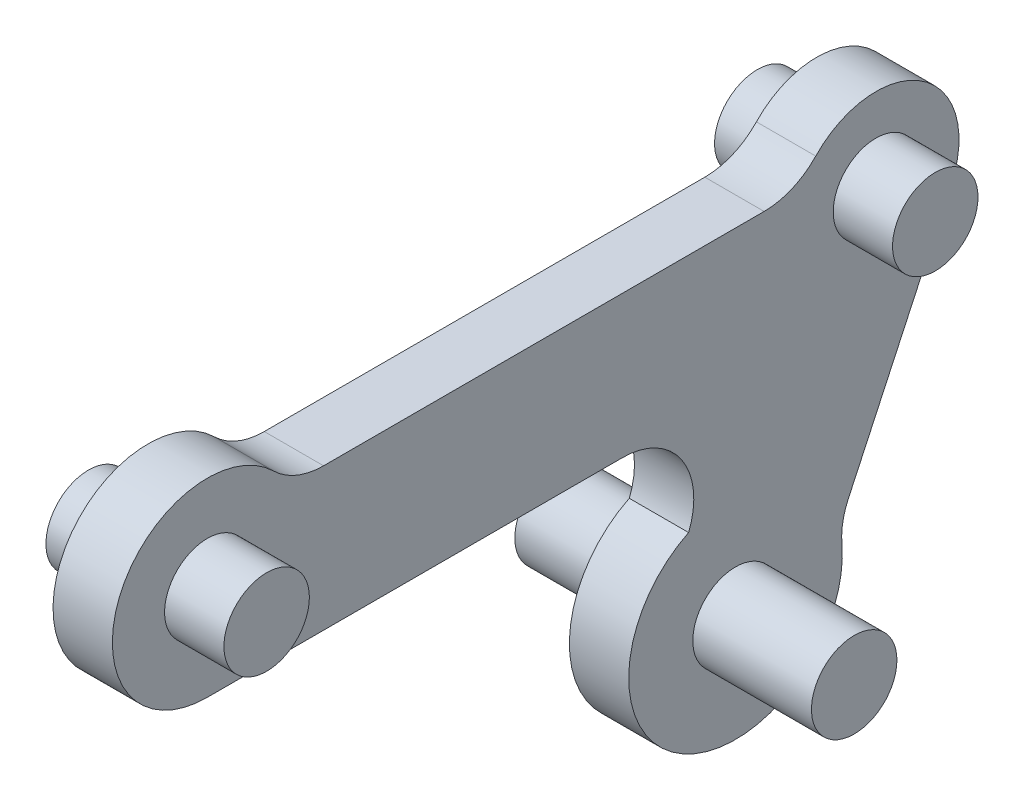
ISO-10303-21;
HEADER;
FILE_DESCRIPTION(('STEP AP214'),'2;1');
FILE_NAME('part.step','',(''),(''),'','','');
FILE_SCHEMA(('AUTOMOTIVE_DESIGN { 1 0 10303 214 1 1 1 1 }'));
ENDSEC;
DATA;
#1=APPLICATION_CONTEXT('core data for automotive mechanical design processes');
#2=APPLICATION_PROTOCOL_DEFINITION('international standard','automotive_design',2000,#1);
#3=PRODUCT_CONTEXT('',#1,'mechanical');
#4=PRODUCT('Part','Part','',(#3));
#5=PRODUCT_RELATED_PRODUCT_CATEGORY('part','',(#4));
#6=PRODUCT_DEFINITION_FORMATION('','',#4);
#7=PRODUCT_DEFINITION_CONTEXT('part definition',#1,'design');
#8=PRODUCT_DEFINITION('design','',#6,#7);
#9=PRODUCT_DEFINITION_SHAPE('','',#8);
#10=(LENGTH_UNIT() NAMED_UNIT(*) SI_UNIT(.MILLI.,.METRE.));
#11=(NAMED_UNIT(*) PLANE_ANGLE_UNIT() SI_UNIT($,.RADIAN.));
#12=(NAMED_UNIT(*) SI_UNIT($,.STERADIAN.) SOLID_ANGLE_UNIT());
#13=UNCERTAINTY_MEASURE_WITH_UNIT(LENGTH_MEASURE(1.E-05),#10,'distance_accuracy_value','');
#14=(GEOMETRIC_REPRESENTATION_CONTEXT(3) GLOBAL_UNCERTAINTY_ASSIGNED_CONTEXT((#13)) GLOBAL_UNIT_ASSIGNED_CONTEXT((#10,
#11,#12)) REPRESENTATION_CONTEXT('',''));
#15=CARTESIAN_POINT('',(0.,0.,0.));
#16=DIRECTION('',(0.,0.,1.));
#17=DIRECTION('',(1.,0.,0.));
#18=AXIS2_PLACEMENT_3D('',#15,#16,#17);
#19=CARTESIAN_POINT('',(1.25,-0.520836083907537,28.1720772546283));
#20=DIRECTION('',(1.,0.,0.));
#21=DIRECTION('',(0.,0.,-1.));
#22=AXIS2_PLACEMENT_3D('',#19,#20,#21);
#23=PLANE('',#22);
#24=CARTESIAN_POINT('',(1.25,-12.6883090185131,5.91665566436985));
#25=DIRECTION('',(1.,0.,0.));
#26=DIRECTION('',(0.,0.,-1.));
#27=AXIS2_PLACEMENT_3D('',#24,#25,#26);
#28=CIRCLE('',#27,1.8);
#29=CARTESIAN_POINT('',(1.25,-12.6883090185131,4.11665566436985));
#30=VERTEX_POINT('',#29);
#31=EDGE_CURVE('E264',#30,#30,#28,.T.);
#32=ORIENTED_EDGE('',*,*,#31,.F.);
#33=EDGE_LOOP('',(#32));
#34=FACE_BOUND('',#33,.T.);
#35=CARTESIAN_POINT('',(1.25,0.,0.));
#36=DIRECTION('',(1.,0.,0.));
#37=DIRECTION('',(0.,0.,-1.));
#38=AXIS2_PLACEMENT_3D('',#35,#36,#37);
#39=CIRCLE('',#38,1.8);
#40=CARTESIAN_POINT('',(1.25,0.,-1.8));
#41=VERTEX_POINT('',#40);
#42=EDGE_CURVE('E269',#41,#41,#39,.T.);
#43=ORIENTED_EDGE('',*,*,#42,.F.);
#44=EDGE_LOOP('',(#43));
#45=FACE_BOUND('',#44,.T.);
#46=CARTESIAN_POINT('',(1.25,-0.520836083907537,28.1720772546283));
#47=DIRECTION('',(1.,0.,0.));
#48=DIRECTION('',(0.,0.,-1.));
#49=AXIS2_PLACEMENT_3D('',#46,#47,#48);
#50=CIRCLE('',#49,1.8);
#51=CARTESIAN_POINT('',(1.25,-0.520836083907537,26.3720772546283));
#52=VERTEX_POINT('',#51);
#53=EDGE_CURVE('E277',#52,#52,#50,.T.);
#54=ORIENTED_EDGE('',*,*,#53,.F.);
#55=EDGE_LOOP('',(#54));
#56=FACE_BOUND('',#55,.T.);
#57=DIRECTION('',(0.,-0.906307787036648,0.422618261740703));
#58=VECTOR('',#57,1.);
#59=CARTESIAN_POINT('',(1.25,-1.47916391609246,-3.17207725462827));
#60=LINE('',#59,#58);
#61=CARTESIAN_POINT('',(1.25,-1.47916391609246,-3.17207725462827));
#62=VERTEX_POINT('',#61);
#63=CARTESIAN_POINT('',(1.25,-10.7763797085491,1.16328566891389));
#64=VERTEX_POINT('',#63);
#65=EDGE_CURVE('E304',#62,#64,#60,.T.);
#66=ORIENTED_EDGE('',*,*,#65,.F.);
#67=CARTESIAN_POINT('',(1.25,0.,0.));
#68=DIRECTION('',(1.,0.,0.));
#69=DIRECTION('',(0.,0.,-1.));
#70=AXIS2_PLACEMENT_3D('',#67,#68,#69);
#71=CIRCLE('',#70,3.5);
#72=CARTESIAN_POINT('',(1.25,2.41185749328056,2.53632478837124));
#73=VERTEX_POINT('',#72);
#74=EDGE_CURVE('E298',#62,#73,#71,.T.);
#75=ORIENTED_EDGE('',*,*,#74,.T.);
#76=CARTESIAN_POINT('',(1.25,4.47916391609246,4.71031746411802));
#77=DIRECTION('',(1.,0.,0.));
#78=DIRECTION('',(0.,0.,-1.));
#79=AXIS2_PLACEMENT_3D('',#76,#77,#78);
#80=CIRCLE('',#79,3.);
#81=CARTESIAN_POINT('',(1.25,1.47916391609246,4.71031746411802));
#82=VERTEX_POINT('',#81);
#83=EDGE_CURVE('E134',#73,#82,#80,.F.);
#84=ORIENTED_EDGE('',*,*,#83,.T.);
#85=DIRECTION('',(0.,0.,-1.));
#86=VECTOR('',#85,1.);
#87=CARTESIAN_POINT('',(1.25,1.47916391609246,28.1720772546283));
#88=LINE('',#87,#86);
#89=CARTESIAN_POINT('',(1.25,1.47916391609246,23.2730977690619));
#90=VERTEX_POINT('',#89);
#91=EDGE_CURVE('E290',#90,#82,#88,.T.);
#92=ORIENTED_EDGE('',*,*,#91,.F.);
#93=CARTESIAN_POINT('',(1.25,4.47916391609246,23.2730977690619));
#94=DIRECTION('',(1.,0.,0.));
#95=DIRECTION('',(0.,0.,-1.));
#96=AXIS2_PLACEMENT_3D('',#93,#94,#95);
#97=CIRCLE('',#96,3.);
#98=CARTESIAN_POINT('',(1.25,2.33630677323532,25.3726604057332));
#99=VERTEX_POINT('',#98);
#100=EDGE_CURVE('E12',#90,#99,#97,.F.);
#101=ORIENTED_EDGE('',*,*,#100,.T.);
#102=CARTESIAN_POINT('',(1.25,-0.520836083907537,28.1720772546283));
#103=DIRECTION('',(1.,0.,0.));
#104=DIRECTION('',(0.,0.,-1.));
#105=AXIS2_PLACEMENT_3D('',#102,#103,#104);
#106=CIRCLE('',#105,3.99999999999999);
#107=CARTESIAN_POINT('',(1.25,-4.52083608390754,28.1720772546283));
#108=VERTEX_POINT('',#107);
#109=EDGE_CURVE('E215',#99,#108,#106,.T.);
#110=ORIENTED_EDGE('',*,*,#109,.T.);
#111=DIRECTION('',(0.,0.,-1.));
#112=VECTOR('',#111,1.);
#113=CARTESIAN_POINT('',(1.25,-4.52083608390754,28.1720772546283));
#114=LINE('',#113,#112);
#115=CARTESIAN_POINT('',(1.25,-4.52083608390754,10.674509524397));
#116=VERTEX_POINT('',#115);
#117=EDGE_CURVE('E211',#108,#116,#114,.T.);
#118=ORIENTED_EDGE('',*,*,#117,.T.);
#119=CARTESIAN_POINT('',(1.25,-7.52083608390754,10.674509524397));
#120=DIRECTION('',(1.,0.,0.));
#121=DIRECTION('',(0.,0.,-1.));
#122=AXIS2_PLACEMENT_3D('',#119,#120,#121);
#123=CIRCLE('',#122,3.);
#124=CARTESIAN_POINT('',(1.25,-8.64571957419743,7.89338796407762));
#125=VERTEX_POINT('',#124);
#126=EDGE_CURVE('E334',#116,#125,#123,.F.);
#127=ORIENTED_EDGE('',*,*,#126,.T.);
#128=CARTESIAN_POINT('',(1.25,-12.6883090185131,5.91665566436985));
#129=DIRECTION('',(1.,0.,0.));
#130=DIRECTION('',(0.,0.,-1.));
#131=AXIS2_PLACEMENT_3D('',#128,#129,#130);
#132=CIRCLE('',#131,4.50000000000002);
#133=CARTESIAN_POINT('',(1.25,-12.3018643036679,1.4332796504303));
#134=VERTEX_POINT('',#133);
#135=EDGE_CURVE('E285',#125,#134,#132,.T.);
#136=ORIENTED_EDGE('',*,*,#135,.T.);
#137=CARTESIAN_POINT('',(1.25,-12.0442344937712,-1.55563769219605));
#138=DIRECTION('',(1.,0.,0.));
#139=DIRECTION('',(0.,0.,-1.));
#140=AXIS2_PLACEMENT_3D('',#137,#138,#139);
#141=CIRCLE('',#140,3.);
#142=EDGE_CURVE('E331',#134,#64,#141,.F.);
#143=ORIENTED_EDGE('',*,*,#142,.T.);
#144=EDGE_LOOP('',(#66,#75,#84,#92,#101,#110,#118,#127,#136,#143));
#145=FACE_BOUND('',#144,.T.);
#146=ADVANCED_FACE('F125',(#34,#45,#56,#145),#23,.T.);
#147=CARTESIAN_POINT('',(1.25,-0.520836083907537,28.1720772546283));
#148=DIRECTION('',(-1.,0.,0.));
#149=DIRECTION('',(0.,0.,1.));
#150=AXIS2_PLACEMENT_3D('',#147,#148,#149);
#151=CYLINDRICAL_SURFACE('',#150,3.99999999999999);
#152=ORIENTED_EDGE('',*,*,#109,.F.);
#153=DIRECTION('',(-1.,0.,0.));
#154=VECTOR('',#153,1.);
#155=CARTESIAN_POINT('',(1.25,2.33630677323532,25.3726604057332));
#156=LINE('',#155,#154);
#157=CARTESIAN_POINT('',(-1.25,2.33630677323532,25.3726604057332));
#158=VERTEX_POINT('',#157);
#159=EDGE_CURVE('E221',#99,#158,#156,.T.);
#160=ORIENTED_EDGE('',*,*,#159,.T.);
#161=CARTESIAN_POINT('',(-1.25,-0.520836083907537,28.1720772546283));
#162=DIRECTION('',(1.,0.,0.));
#163=DIRECTION('',(0.,0.,-1.));
#164=AXIS2_PLACEMENT_3D('',#161,#162,#163);
#165=CIRCLE('',#164,3.99999999999999);
#166=CARTESIAN_POINT('',(-1.25,-4.52083608390754,28.1720772546283));
#167=VERTEX_POINT('',#166);
#168=EDGE_CURVE('E218',#158,#167,#165,.T.);
#169=ORIENTED_EDGE('',*,*,#168,.T.);
#170=DIRECTION('',(-1.,0.,0.));
#171=VECTOR('',#170,1.);
#172=CARTESIAN_POINT('',(1.25,-4.52083608390753,28.1720772546283));
#173=LINE('',#172,#171);
#174=EDGE_CURVE('E204',#108,#167,#173,.T.);
#175=ORIENTED_EDGE('',*,*,#174,.F.);
#176=EDGE_LOOP('',(#152,#160,#169,#175));
#177=FACE_BOUND('',#176,.T.);
#178=ADVANCED_FACE('F219',(#177),#151,.T.);
#179=CARTESIAN_POINT('',(1.25,-12.6883090185131,5.91665566436985));
#180=DIRECTION('',(-1.,0.,0.));
#181=DIRECTION('',(0.,0.,1.));
#182=AXIS2_PLACEMENT_3D('',#179,#180,#181);
#183=CYLINDRICAL_SURFACE('',#182,4.50000000000002);
#184=DIRECTION('',(-1.,0.,0.));
#185=VECTOR('',#184,1.);
#186=CARTESIAN_POINT('',(1.25,-8.64571957419743,7.89338796407762));
#187=LINE('',#186,#185);
#188=CARTESIAN_POINT('',(-1.25,-8.64571957419743,7.89338796407762));
#189=VERTEX_POINT('',#188);
#190=EDGE_CURVE('E301',#125,#189,#187,.T.);
#191=ORIENTED_EDGE('',*,*,#190,.T.);
#192=CARTESIAN_POINT('',(-1.25,-12.6883090185131,5.91665566436985));
#193=DIRECTION('',(1.,0.,0.));
#194=DIRECTION('',(0.,0.,-1.));
#195=AXIS2_PLACEMENT_3D('',#192,#193,#194);
#196=CIRCLE('',#195,4.50000000000002);
#197=CARTESIAN_POINT('',(-1.25,-12.3018643036679,1.4332796504303));
#198=VERTEX_POINT('',#197);
#199=EDGE_CURVE('E247',#189,#198,#196,.T.);
#200=ORIENTED_EDGE('',*,*,#199,.T.);
#201=DIRECTION('',(-1.,0.,0.));
#202=VECTOR('',#201,1.);
#203=CARTESIAN_POINT('',(1.25,-12.3018643036679,1.4332796504303));
#204=LINE('',#203,#202);
#205=EDGE_CURVE('E315',#198,#134,#204,.F.);
#206=ORIENTED_EDGE('',*,*,#205,.T.);
#207=ORIENTED_EDGE('',*,*,#135,.F.);
#208=EDGE_LOOP('',(#191,#200,#206,#207));
#209=FACE_BOUND('',#208,.T.);
#210=ADVANCED_FACE('F359',(#209),#183,.T.);
#211=CARTESIAN_POINT('',(1.25,-1.47916391609246,-3.17207725462827));
#212=DIRECTION('',(0.,-0.422618261740703,-0.906307787036648));
#213=DIRECTION('',(0.,0.906307787036648,-0.422618261740703));
#214=AXIS2_PLACEMENT_3D('',#211,#212,#213);
#215=PLANE('',#214);
#216=ORIENTED_EDGE('',*,*,#65,.T.);
#217=DIRECTION('',(-1.,0.,0.));
#218=VECTOR('',#217,1.);
#219=CARTESIAN_POINT('',(1.25,-10.7763797085491,1.16328566891389));
#220=LINE('',#219,#218);
#221=CARTESIAN_POINT('',(-1.25,-10.7763797085491,1.16328566891389));
#222=VERTEX_POINT('',#221);
#223=EDGE_CURVE('E214',#64,#222,#220,.T.);
#224=ORIENTED_EDGE('',*,*,#223,.T.);
#225=DIRECTION('',(0.,-0.906307787036648,0.422618261740703));
#226=VECTOR('',#225,1.);
#227=CARTESIAN_POINT('',(-1.25,-1.47916391609246,-3.17207725462827));
#228=LINE('',#227,#226);
#229=CARTESIAN_POINT('',(-1.25,-1.47916391609246,-3.17207725462827));
#230=VERTEX_POINT('',#229);
#231=EDGE_CURVE('E241',#230,#222,#228,.T.);
#232=ORIENTED_EDGE('',*,*,#231,.F.);
#233=DIRECTION('',(-1.,0.,0.));
#234=VECTOR('',#233,1.);
#235=CARTESIAN_POINT('',(1.25,-1.47916391609246,-3.17207725462827));
#236=LINE('',#235,#234);
#237=EDGE_CURVE('E294',#62,#230,#236,.T.);
#238=ORIENTED_EDGE('',*,*,#237,.F.);
#239=EDGE_LOOP('',(#216,#224,#232,#238));
#240=FACE_BOUND('',#239,.T.);
#241=ADVANCED_FACE('F365',(#240),#215,.T.);
#242=CARTESIAN_POINT('',(1.25,0.,0.));
#243=DIRECTION('',(-1.,0.,0.));
#244=DIRECTION('',(0.,0.,1.));
#245=AXIS2_PLACEMENT_3D('',#242,#243,#244);
#246=CYLINDRICAL_SURFACE('',#245,3.5);
#247=ORIENTED_EDGE('',*,*,#237,.T.);
#248=CARTESIAN_POINT('',(-1.25,0.,0.));
#249=DIRECTION('',(1.,0.,0.));
#250=DIRECTION('',(0.,0.,-1.));
#251=AXIS2_PLACEMENT_3D('',#248,#249,#250);
#252=CIRCLE('',#251,3.5);
#253=CARTESIAN_POINT('',(-1.25,2.41185749328056,2.53632478837124));
#254=VERTEX_POINT('',#253);
#255=EDGE_CURVE('E235',#230,#254,#252,.T.);
#256=ORIENTED_EDGE('',*,*,#255,.T.);
#257=DIRECTION('',(-1.,0.,0.));
#258=VECTOR('',#257,1.);
#259=CARTESIAN_POINT('',(1.25,2.41185749328056,2.53632478837124));
#260=LINE('',#259,#258);
#261=EDGE_CURVE('E147',#254,#73,#260,.F.);
#262=ORIENTED_EDGE('',*,*,#261,.T.);
#263=ORIENTED_EDGE('',*,*,#74,.F.);
#264=EDGE_LOOP('',(#247,#256,#262,#263));
#265=FACE_BOUND('',#264,.T.);
#266=ADVANCED_FACE('F371',(#265),#246,.T.);
#267=CARTESIAN_POINT('',(1.25,1.47916391609246,28.1720772546283));
#268=DIRECTION('',(0.,1.,0.));
#269=DIRECTION('',(0.,0.,1.));
#270=AXIS2_PLACEMENT_3D('',#267,#268,#269);
#271=PLANE('',#270);
#272=ORIENTED_EDGE('',*,*,#91,.T.);
#273=DIRECTION('',(-1.,0.,0.));
#274=VECTOR('',#273,1.);
#275=CARTESIAN_POINT('',(1.25,1.47916391609246,4.71031746411802));
#276=LINE('',#275,#274);
#277=CARTESIAN_POINT('',(-1.25,1.47916391609246,4.71031746411802));
#278=VERTEX_POINT('',#277);
#279=EDGE_CURVE('E324',#82,#278,#276,.T.);
#280=ORIENTED_EDGE('',*,*,#279,.T.);
#281=DIRECTION('',(0.,0.,-1.));
#282=VECTOR('',#281,1.);
#283=CARTESIAN_POINT('',(-1.25,1.47916391609246,28.1720772546283));
#284=LINE('',#283,#282);
#285=CARTESIAN_POINT('',(-1.25,1.47916391609246,23.2730977690619));
#286=VERTEX_POINT('',#285);
#287=EDGE_CURVE('E227',#286,#278,#284,.T.);
#288=ORIENTED_EDGE('',*,*,#287,.F.);
#289=DIRECTION('',(-1.,0.,0.));
#290=VECTOR('',#289,1.);
#291=CARTESIAN_POINT('',(1.25,1.47916391609246,23.2730977690619));
#292=LINE('',#291,#290);
#293=EDGE_CURVE('E321',#286,#90,#292,.F.);
#294=ORIENTED_EDGE('',*,*,#293,.T.);
#295=EDGE_LOOP('',(#272,#280,#288,#294));
#296=FACE_BOUND('',#295,.T.);
#297=ADVANCED_FACE('F342',(#296),#271,.T.);
#298=CARTESIAN_POINT('',(1.25,-4.52083608390754,28.1720772546283));
#299=DIRECTION('',(0.,1.,0.));
#300=DIRECTION('',(0.,0.,1.));
#301=AXIS2_PLACEMENT_3D('',#298,#299,#300);
#302=PLANE('',#301);
#303=ORIENTED_EDGE('',*,*,#174,.T.);
#304=DIRECTION('',(0.,0.,-1.));
#305=VECTOR('',#304,1.);
#306=CARTESIAN_POINT('',(-1.25,-4.52083608390754,28.1720772546283));
#307=LINE('',#306,#305);
#308=CARTESIAN_POINT('',(-1.25,-4.52083608390754,10.674509524397));
#309=VERTEX_POINT('',#308);
#310=EDGE_CURVE('E208',#167,#309,#307,.T.);
#311=ORIENTED_EDGE('',*,*,#310,.T.);
#312=DIRECTION('',(-1.,0.,0.));
#313=VECTOR('',#312,1.);
#314=CARTESIAN_POINT('',(1.25,-4.52083608390754,10.674509524397));
#315=LINE('',#314,#313);
#316=EDGE_CURVE('E318',#309,#116,#315,.F.);
#317=ORIENTED_EDGE('',*,*,#316,.T.);
#318=ORIENTED_EDGE('',*,*,#117,.F.);
#319=EDGE_LOOP('',(#303,#311,#317,#318));
#320=FACE_BOUND('',#319,.T.);
#321=ADVANCED_FACE('F206',(#320),#302,.F.);
#322=CARTESIAN_POINT('',(1.25,-12.0442344937712,-1.55563769219605));
#323=DIRECTION('',(-1.,0.,0.));
#324=DIRECTION('',(0.,0.,1.));
#325=AXIS2_PLACEMENT_3D('',#322,#323,#324);
#326=CYLINDRICAL_SURFACE('',#325,3.);
#327=ORIENTED_EDGE('',*,*,#142,.F.);
#328=ORIENTED_EDGE('',*,*,#205,.F.);
#329=CARTESIAN_POINT('',(-1.25,-12.0442344937712,-1.55563769219605));
#330=DIRECTION('',(1.,0.,0.));
#331=DIRECTION('',(0.,0.,-1.));
#332=AXIS2_PLACEMENT_3D('',#329,#330,#331);
#333=CIRCLE('',#332,3.);
#334=EDGE_CURVE('E226',#198,#222,#333,.F.);
#335=ORIENTED_EDGE('',*,*,#334,.T.);
#336=ORIENTED_EDGE('',*,*,#223,.F.);
#337=EDGE_LOOP('',(#327,#328,#335,#336));
#338=FACE_BOUND('',#337,.T.);
#339=ADVANCED_FACE('F370',(#338),#326,.F.);
#340=CARTESIAN_POINT('',(1.25,-7.52083608390754,10.674509524397));
#341=DIRECTION('',(-1.,0.,0.));
#342=DIRECTION('',(0.,0.,1.));
#343=AXIS2_PLACEMENT_3D('',#340,#341,#342);
#344=CYLINDRICAL_SURFACE('',#343,3.);
#345=ORIENTED_EDGE('',*,*,#126,.F.);
#346=ORIENTED_EDGE('',*,*,#316,.F.);
#347=CARTESIAN_POINT('',(-1.25,-7.52083608390754,10.674509524397));
#348=DIRECTION('',(1.,0.,0.));
#349=DIRECTION('',(0.,0.,-1.));
#350=AXIS2_PLACEMENT_3D('',#347,#348,#349);
#351=CIRCLE('',#350,3.);
#352=EDGE_CURVE('E233',#309,#189,#351,.F.);
#353=ORIENTED_EDGE('',*,*,#352,.T.);
#354=ORIENTED_EDGE('',*,*,#190,.F.);
#355=EDGE_LOOP('',(#345,#346,#353,#354));
#356=FACE_BOUND('',#355,.T.);
#357=ADVANCED_FACE('F357',(#356),#344,.F.);
#358=CARTESIAN_POINT('',(1.25,4.47916391609246,4.71031746411802));
#359=DIRECTION('',(-1.,0.,0.));
#360=DIRECTION('',(0.,0.,1.));
#361=AXIS2_PLACEMENT_3D('',#358,#359,#360);
#362=CYLINDRICAL_SURFACE('',#361,3.);
#363=ORIENTED_EDGE('',*,*,#83,.F.);
#364=ORIENTED_EDGE('',*,*,#261,.F.);
#365=CARTESIAN_POINT('',(-1.25,4.47916391609246,4.71031746411802));
#366=DIRECTION('',(1.,0.,0.));
#367=DIRECTION('',(0.,0.,-1.));
#368=AXIS2_PLACEMENT_3D('',#365,#366,#367);
#369=CIRCLE('',#368,3.);
#370=EDGE_CURVE('E257',#254,#278,#369,.F.);
#371=ORIENTED_EDGE('',*,*,#370,.T.);
#372=ORIENTED_EDGE('',*,*,#279,.F.);
#373=EDGE_LOOP('',(#363,#364,#371,#372));
#374=FACE_BOUND('',#373,.T.);
#375=ADVANCED_FACE('F344',(#374),#362,.F.);
#376=CARTESIAN_POINT('',(1.25,4.47916391609246,23.2730977690619));
#377=DIRECTION('',(-1.,0.,0.));
#378=DIRECTION('',(0.,0.,1.));
#379=AXIS2_PLACEMENT_3D('',#376,#377,#378);
#380=CYLINDRICAL_SURFACE('',#379,3.);
#381=ORIENTED_EDGE('',*,*,#100,.F.);
#382=ORIENTED_EDGE('',*,*,#293,.F.);
#383=CARTESIAN_POINT('',(-1.25,4.47916391609246,23.2730977690619));
#384=DIRECTION('',(1.,0.,0.));
#385=DIRECTION('',(0.,0.,-1.));
#386=AXIS2_PLACEMENT_3D('',#383,#384,#385);
#387=CIRCLE('',#386,3.);
#388=EDGE_CURVE('E261',#286,#158,#387,.F.);
#389=ORIENTED_EDGE('',*,*,#388,.T.);
#390=ORIENTED_EDGE('',*,*,#159,.F.);
#391=EDGE_LOOP('',(#381,#382,#389,#390));
#392=FACE_BOUND('',#391,.T.);
#393=ADVANCED_FACE('F127',(#392),#380,.F.);
#394=CARTESIAN_POINT('',(3.75,-0.520836083907537,28.1720772546283));
#395=DIRECTION('',(-1.,0.,0.));
#396=DIRECTION('',(0.,0.,1.));
#397=AXIS2_PLACEMENT_3D('',#394,#395,#396);
#398=CYLINDRICAL_SURFACE('',#397,1.8);
#399=CARTESIAN_POINT('',(3.75,-0.520836083907537,28.1720772546283));
#400=DIRECTION('',(1.,0.,0.));
#401=DIRECTION('',(0.,0.,-1.));
#402=AXIS2_PLACEMENT_3D('',#399,#400,#401);
#403=CIRCLE('',#402,1.8);
#404=CARTESIAN_POINT('',(3.75,-0.520836083907537,26.3720772546283));
#405=VERTEX_POINT('',#404);
#406=EDGE_CURVE('E281',#405,#405,#403,.T.);
#407=ORIENTED_EDGE('',*,*,#406,.F.);
#408=EDGE_LOOP('',(#407));
#409=FACE_BOUND('',#408,.T.);
#410=ORIENTED_EDGE('',*,*,#53,.T.);
#411=EDGE_LOOP('',(#410));
#412=FACE_BOUND('',#411,.T.);
#413=ADVANCED_FACE('F349',(#409,#412),#398,.T.);
#414=CARTESIAN_POINT('',(3.75,0.,0.));
#415=DIRECTION('',(1.,0.,0.));
#416=DIRECTION('',(0.,0.,-1.));
#417=AXIS2_PLACEMENT_3D('',#414,#415,#416);
#418=PLANE('',#417);
#419=ORIENTED_EDGE('',*,*,#406,.T.);
#420=EDGE_LOOP('',(#419));
#421=FACE_BOUND('',#420,.T.);
#422=ADVANCED_FACE('F354',(#421),#418,.T.);
#423=CARTESIAN_POINT('',(3.75,0.,0.));
#424=DIRECTION('',(-1.,0.,0.));
#425=DIRECTION('',(0.,0.,1.));
#426=AXIS2_PLACEMENT_3D('',#423,#424,#425);
#427=CYLINDRICAL_SURFACE('',#426,1.8);
#428=CARTESIAN_POINT('',(3.75,0.,0.));
#429=DIRECTION('',(1.,0.,0.));
#430=DIRECTION('',(0.,0.,-1.));
#431=AXIS2_PLACEMENT_3D('',#428,#429,#430);
#432=CIRCLE('',#431,1.8);
#433=CARTESIAN_POINT('',(3.75,0.,-1.8));
#434=VERTEX_POINT('',#433);
#435=EDGE_CURVE('E273',#434,#434,#432,.T.);
#436=ORIENTED_EDGE('',*,*,#435,.F.);
#437=EDGE_LOOP('',(#436));
#438=FACE_BOUND('',#437,.T.);
#439=ORIENTED_EDGE('',*,*,#42,.T.);
#440=EDGE_LOOP('',(#439));
#441=FACE_BOUND('',#440,.T.);
#442=ADVANCED_FACE('F498',(#438,#441),#427,.T.);
#443=CARTESIAN_POINT('',(3.75,0.,0.));
#444=DIRECTION('',(1.,0.,0.));
#445=DIRECTION('',(0.,0.,-1.));
#446=AXIS2_PLACEMENT_3D('',#443,#444,#445);
#447=PLANE('',#446);
#448=ORIENTED_EDGE('',*,*,#435,.T.);
#449=EDGE_LOOP('',(#448));
#450=FACE_BOUND('',#449,.T.);
#451=ADVANCED_FACE('F494',(#450),#447,.T.);
#452=CARTESIAN_POINT('',(6.25,-12.6883090185131,5.91665566436985));
#453=DIRECTION('',(-1.,0.,0.));
#454=DIRECTION('',(0.,0.,1.));
#455=AXIS2_PLACEMENT_3D('',#452,#453,#454);
#456=CYLINDRICAL_SURFACE('',#455,1.8);
#457=CARTESIAN_POINT('',(6.25,-12.6883090185131,5.91665566436985));
#458=DIRECTION('',(1.,0.,0.));
#459=DIRECTION('',(0.,0.,-1.));
#460=AXIS2_PLACEMENT_3D('',#457,#458,#459);
#461=CIRCLE('',#460,1.8);
#462=CARTESIAN_POINT('',(6.25,-12.6883090185131,4.11665566436985));
#463=VERTEX_POINT('',#462);
#464=EDGE_CURVE('E265',#463,#463,#461,.T.);
#465=ORIENTED_EDGE('',*,*,#464,.F.);
#466=EDGE_LOOP('',(#465));
#467=FACE_BOUND('',#466,.T.);
#468=ORIENTED_EDGE('',*,*,#31,.T.);
#469=EDGE_LOOP('',(#468));
#470=FACE_BOUND('',#469,.T.);
#471=ADVANCED_FACE('F490',(#467,#470),#456,.T.);
#472=CARTESIAN_POINT('',(6.25,0.,0.));
#473=DIRECTION('',(1.,0.,0.));
#474=DIRECTION('',(0.,0.,-1.));
#475=AXIS2_PLACEMENT_3D('',#472,#473,#474);
#476=PLANE('',#475);
#477=ORIENTED_EDGE('',*,*,#464,.T.);
#478=EDGE_LOOP('',(#477));
#479=FACE_BOUND('',#478,.T.);
#480=ADVANCED_FACE('F421',(#479),#476,.T.);
#481=CARTESIAN_POINT('',(-1.25,-0.520836083907537,28.1720772546283));
#482=DIRECTION('',(-1.,0.,0.));
#483=DIRECTION('',(0.,0.,-1.));
#484=AXIS2_PLACEMENT_3D('',#481,#482,#483);
#485=PLANE('',#484);
#486=CARTESIAN_POINT('',(-1.25,-12.6883090185131,5.91665566436985));
#487=DIRECTION('',(1.,0.,0.));
#488=DIRECTION('',(0.,0.,-1.));
#489=AXIS2_PLACEMENT_3D('',#486,#487,#488);
#490=CIRCLE('',#489,1.8);
#491=CARTESIAN_POINT('',(-1.25,-12.6883090185131,4.11665566436985));
#492=VERTEX_POINT('',#491);
#493=EDGE_CURVE('E637',#492,#492,#490,.T.);
#494=ORIENTED_EDGE('',*,*,#493,.T.);
#495=EDGE_LOOP('',(#494));
#496=FACE_BOUND('',#495,.T.);
#497=CARTESIAN_POINT('',(-1.25,0.,0.));
#498=DIRECTION('',(1.,0.,0.));
#499=DIRECTION('',(0.,0.,-1.));
#500=AXIS2_PLACEMENT_3D('',#497,#498,#499);
#501=CIRCLE('',#500,1.8);
#502=CARTESIAN_POINT('',(-1.25,0.,-1.8));
#503=VERTEX_POINT('',#502);
#504=EDGE_CURVE('E636',#503,#503,#501,.T.);
#505=ORIENTED_EDGE('',*,*,#504,.T.);
#506=EDGE_LOOP('',(#505));
#507=FACE_BOUND('',#506,.T.);
#508=CARTESIAN_POINT('',(-1.25,-0.520836083907537,28.1720772546283));
#509=DIRECTION('',(1.,0.,0.));
#510=DIRECTION('',(0.,0.,-1.));
#511=AXIS2_PLACEMENT_3D('',#508,#509,#510);
#512=CIRCLE('',#511,1.8);
#513=CARTESIAN_POINT('',(-1.25,-0.520836083907537,26.3720772546283));
#514=VERTEX_POINT('',#513);
#515=EDGE_CURVE('E649',#514,#514,#512,.T.);
#516=ORIENTED_EDGE('',*,*,#515,.T.);
#517=EDGE_LOOP('',(#516));
#518=FACE_BOUND('',#517,.T.);
#519=ORIENTED_EDGE('',*,*,#231,.T.);
#520=ORIENTED_EDGE('',*,*,#334,.F.);
#521=ORIENTED_EDGE('',*,*,#199,.F.);
#522=ORIENTED_EDGE('',*,*,#352,.F.);
#523=ORIENTED_EDGE('',*,*,#310,.F.);
#524=ORIENTED_EDGE('',*,*,#168,.F.);
#525=ORIENTED_EDGE('',*,*,#388,.F.);
#526=ORIENTED_EDGE('',*,*,#287,.T.);
#527=ORIENTED_EDGE('',*,*,#370,.F.);
#528=ORIENTED_EDGE('',*,*,#255,.F.);
#529=EDGE_LOOP('',(#519,#520,#521,#522,#523,#524,#525,#526,#527,#528));
#530=FACE_BOUND('',#529,.T.);
#531=ADVANCED_FACE('F230',(#496,#507,#518,#530),#485,.T.);
#532=CARTESIAN_POINT('',(-3.75,-0.520836083907537,28.1720772546283));
#533=DIRECTION('',(1.,0.,0.));
#534=DIRECTION('',(0.,0.,1.));
#535=AXIS2_PLACEMENT_3D('',#532,#533,#534);
#536=CYLINDRICAL_SURFACE('',#535,1.8);
#537=CARTESIAN_POINT('',(-3.75,-0.520836083907537,28.1720772546283));
#538=DIRECTION('',(1.,0.,0.));
#539=DIRECTION('',(0.,0.,-1.));
#540=AXIS2_PLACEMENT_3D('',#537,#538,#539);
#541=CIRCLE('',#540,1.8);
#542=CARTESIAN_POINT('',(-3.75,-0.520836083907537,26.3720772546283));
#543=VERTEX_POINT('',#542);
#544=EDGE_CURVE('E251',#543,#543,#541,.T.);
#545=ORIENTED_EDGE('',*,*,#544,.T.);
#546=EDGE_LOOP('',(#545));
#547=FACE_BOUND('',#546,.T.);
#548=ORIENTED_EDGE('',*,*,#515,.F.);
#549=EDGE_LOOP('',(#548));
#550=FACE_BOUND('',#549,.T.);
#551=ADVANCED_FACE('F420',(#547,#550),#536,.T.);
#552=CARTESIAN_POINT('',(-3.75,0.,0.));
#553=DIRECTION('',(-1.,0.,0.));
#554=DIRECTION('',(0.,0.,-1.));
#555=AXIS2_PLACEMENT_3D('',#552,#553,#554);
#556=PLANE('',#555);
#557=ORIENTED_EDGE('',*,*,#544,.F.);
#558=EDGE_LOOP('',(#557));
#559=FACE_BOUND('',#558,.T.);
#560=ADVANCED_FACE('F433',(#559),#556,.T.);
#561=CARTESIAN_POINT('',(-3.75,0.,0.));
#562=DIRECTION('',(1.,0.,0.));
#563=DIRECTION('',(0.,0.,1.));
#564=AXIS2_PLACEMENT_3D('',#561,#562,#563);
#565=CYLINDRICAL_SURFACE('',#564,1.8);
#566=CARTESIAN_POINT('',(-3.75,0.,0.));
#567=DIRECTION('',(1.,0.,0.));
#568=DIRECTION('',(0.,0.,-1.));
#569=AXIS2_PLACEMENT_3D('',#566,#567,#568);
#570=CIRCLE('',#569,1.8);
#571=CARTESIAN_POINT('',(-3.75,0.,-1.8));
#572=VERTEX_POINT('',#571);
#573=EDGE_CURVE('E642',#572,#572,#570,.T.);
#574=ORIENTED_EDGE('',*,*,#573,.T.);
#575=EDGE_LOOP('',(#574));
#576=FACE_BOUND('',#575,.T.);
#577=ORIENTED_EDGE('',*,*,#504,.F.);
#578=EDGE_LOOP('',(#577));
#579=FACE_BOUND('',#578,.T.);
#580=ADVANCED_FACE('F443',(#576,#579),#565,.T.);
#581=CARTESIAN_POINT('',(-3.75,0.,0.));
#582=DIRECTION('',(-1.,0.,0.));
#583=DIRECTION('',(0.,0.,-1.));
#584=AXIS2_PLACEMENT_3D('',#581,#582,#583);
#585=PLANE('',#584);
#586=ORIENTED_EDGE('',*,*,#573,.F.);
#587=EDGE_LOOP('',(#586));
#588=FACE_BOUND('',#587,.T.);
#589=ADVANCED_FACE('F453',(#588),#585,.T.);
#590=CARTESIAN_POINT('',(-6.25,-12.6883090185131,5.91665566436985));
#591=DIRECTION('',(1.,0.,0.));
#592=DIRECTION('',(0.,0.,1.));
#593=AXIS2_PLACEMENT_3D('',#590,#591,#592);
#594=CYLINDRICAL_SURFACE('',#593,1.8);
#595=CARTESIAN_POINT('',(-6.25,-12.6883090185131,5.91665566436985));
#596=DIRECTION('',(1.,0.,0.));
#597=DIRECTION('',(0.,0.,-1.));
#598=AXIS2_PLACEMENT_3D('',#595,#596,#597);
#599=CIRCLE('',#598,1.8);
#600=CARTESIAN_POINT('',(-6.25,-12.6883090185131,4.11665566436985));
#601=VERTEX_POINT('',#600);
#602=EDGE_CURVE('E634',#601,#601,#599,.T.);
#603=ORIENTED_EDGE('',*,*,#602,.T.);
#604=EDGE_LOOP('',(#603));
#605=FACE_BOUND('',#604,.T.);
#606=ORIENTED_EDGE('',*,*,#493,.F.);
#607=EDGE_LOOP('',(#606));
#608=FACE_BOUND('',#607,.T.);
#609=ADVANCED_FACE('F463',(#605,#608),#594,.T.);
#610=CARTESIAN_POINT('',(-6.25,0.,0.));
#611=DIRECTION('',(-1.,0.,0.));
#612=DIRECTION('',(0.,0.,-1.));
#613=AXIS2_PLACEMENT_3D('',#610,#611,#612);
#614=PLANE('',#613);
#615=ORIENTED_EDGE('',*,*,#602,.F.);
#616=EDGE_LOOP('',(#615));
#617=FACE_BOUND('',#616,.T.);
#618=ADVANCED_FACE('F473',(#617),#614,.T.);
#619=CLOSED_SHELL('',(#146,#178,#210,#241,#266,#297,#321,#339,#357,#375,#393,#413,#422,#442,
#451,#471,#480,#531,#551,#560,#580,#589,#609,#618));
#620=MANIFOLD_SOLID_BREP('B2',#619);
#621=ADVANCED_BREP_SHAPE_REPRESENTATION('',(#18,#620),#14);
#622=SHAPE_DEFINITION_REPRESENTATION(#9,#621);
ENDSEC;
END-ISO-10303-21;
